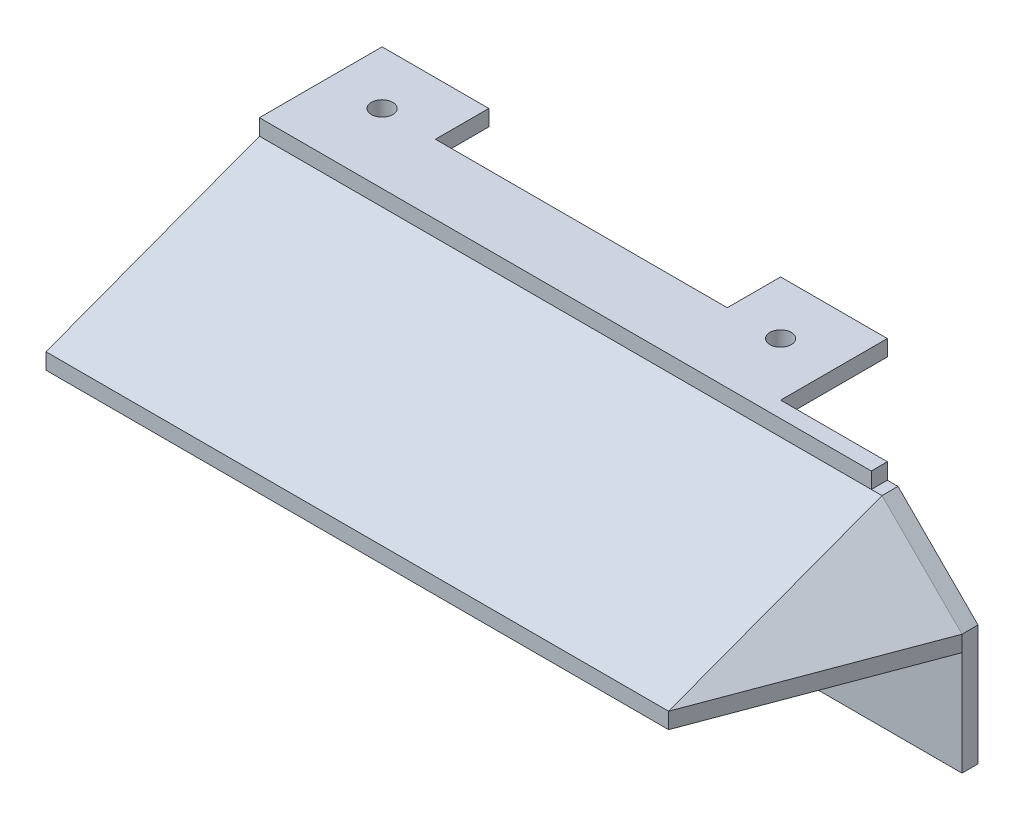
ISO-10303-21;
HEADER;
FILE_DESCRIPTION(('STEP AP214'),'2;1');
FILE_NAME('part.step','',(''),(''),'','','');
FILE_SCHEMA(('AUTOMOTIVE_DESIGN { 1 0 10303 214 1 1 1 1 }'));
ENDSEC;
DATA;
#1=APPLICATION_CONTEXT('core data for automotive mechanical design processes');
#2=APPLICATION_PROTOCOL_DEFINITION('international standard','automotive_design',2000,#1);
#3=PRODUCT_CONTEXT('',#1,'mechanical');
#4=PRODUCT('Part','Part','',(#3));
#5=PRODUCT_RELATED_PRODUCT_CATEGORY('part','',(#4));
#6=PRODUCT_DEFINITION_FORMATION('','',#4);
#7=PRODUCT_DEFINITION_CONTEXT('part definition',#1,'design');
#8=PRODUCT_DEFINITION('design','',#6,#7);
#9=PRODUCT_DEFINITION_SHAPE('','',#8);
#10=(LENGTH_UNIT() NAMED_UNIT(*) SI_UNIT(.MILLI.,.METRE.));
#11=(NAMED_UNIT(*) PLANE_ANGLE_UNIT() SI_UNIT($,.RADIAN.));
#12=(NAMED_UNIT(*) SI_UNIT($,.STERADIAN.) SOLID_ANGLE_UNIT());
#13=UNCERTAINTY_MEASURE_WITH_UNIT(LENGTH_MEASURE(1.E-05),#10,'distance_accuracy_value','');
#14=(GEOMETRIC_REPRESENTATION_CONTEXT(3) GLOBAL_UNCERTAINTY_ASSIGNED_CONTEXT((#13)) GLOBAL_UNIT_ASSIGNED_CONTEXT((#10,
#11,#12)) REPRESENTATION_CONTEXT('',''));
#15=CARTESIAN_POINT('',(0.,0.,0.));
#16=DIRECTION('',(0.,0.,1.));
#17=DIRECTION('',(1.,0.,0.));
#18=AXIS2_PLACEMENT_3D('',#15,#16,#17);
#19=CARTESIAN_POINT('',(0.,0.,-37.2162428883249));
#20=DIRECTION('',(0.,0.,1.));
#21=DIRECTION('',(1.,0.,0.));
#22=AXIS2_PLACEMENT_3D('',#19,#20,#21);
#23=PLANE('',#22);
#24=DIRECTION('',(1.,0.,0.));
#25=VECTOR('',#24,1.);
#26=CARTESIAN_POINT('',(0.,-14.9977348289667,-37.2162428883249));
#27=LINE('',#26,#25);
#28=CARTESIAN_POINT('',(-122.390736685816,-14.9977348289667,-37.2162428883249));
#29=VERTEX_POINT('',#28);
#30=CARTESIAN_POINT('',(4.91634592782475,-14.9977348289667,-37.2162428883249));
#31=VERTEX_POINT('',#30);
#32=EDGE_CURVE('E376',#29,#31,#27,.T.);
#33=ORIENTED_EDGE('',*,*,#32,.T.);
#34=DIRECTION('',(0.662200830713101,-0.749326404047582,0.));
#35=VECTOR('',#34,1.);
#36=CARTESIAN_POINT('',(-5.68638997938709,-3.00000000000002,-37.2162428883249));
#37=LINE('',#36,#35);
#38=CARTESIAN_POINT('',(-5.68638997938709,-3.00000000000001,-37.2162428883249));
#39=VERTEX_POINT('',#38);
#40=EDGE_CURVE('E203',#39,#31,#37,.T.);
#41=ORIENTED_EDGE('',*,*,#40,.F.);
#42=DIRECTION('',(1.,0.,0.));
#43=VECTOR('',#42,1.);
#44=CARTESIAN_POINT('',(-122.390736685816,-3.00000000000001,-37.2162428883249));
#45=LINE('',#44,#43);
#46=CARTESIAN_POINT('',(-122.390736685816,-3.00000000000001,-37.2162428883249));
#47=VERTEX_POINT('',#46);
#48=EDGE_CURVE('E394',#47,#39,#45,.T.);
#49=ORIENTED_EDGE('',*,*,#48,.F.);
#50=DIRECTION('',(0.,-1.,0.));
#51=VECTOR('',#50,1.);
#52=CARTESIAN_POINT('',(-122.390736685816,0.,-37.2162428883249));
#53=LINE('',#52,#51);
#54=EDGE_CURVE('E492',#47,#29,#53,.T.);
#55=ORIENTED_EDGE('',*,*,#54,.T.);
#56=EDGE_LOOP('',(#33,#41,#49,#55));
#57=FACE_BOUND('',#56,.T.);
#58=ADVANCED_FACE('F49',(#57),#23,.T.);
#59=DIRECTION('',(0.,-1.,0.));
#60=VECTOR('',#59,1.);
#61=CARTESIAN_POINT('',(9.31134484957959,0.,-37.2162428883249));
#62=LINE('',#61,#60);
#63=CARTESIAN_POINT('',(9.31134484957959,-17.9977348289667,-37.2162428883249));
#64=VERTEX_POINT('',#63);
#65=CARTESIAN_POINT('',(9.31134484957959,-37.5577348289667,-37.2162428883249));
#66=VERTEX_POINT('',#65);
#67=EDGE_CURVE('E253',#64,#66,#62,.T.);
#68=ORIENTED_EDGE('',*,*,#67,.F.);
#69=DIRECTION('',(-1.,0.,0.));
#70=VECTOR('',#69,1.);
#71=CARTESIAN_POINT('',(0.,-17.9977348289667,-37.2162428883249));
#72=LINE('',#71,#70);
#73=CARTESIAN_POINT('',(-122.390736685816,-17.9977348289667,-37.2162428883249));
#74=VERTEX_POINT('',#73);
#75=EDGE_CURVE('E228',#64,#74,#72,.T.);
#76=ORIENTED_EDGE('',*,*,#75,.T.);
#77=CARTESIAN_POINT('',(-122.390736685816,-37.5577348289667,-37.2162428883249));
#78=VERTEX_POINT('',#77);
#79=EDGE_CURVE('E489',#74,#78,#53,.T.);
#80=ORIENTED_EDGE('',*,*,#79,.T.);
#81=DIRECTION('',(-1.,0.,0.));
#82=VECTOR('',#81,1.);
#83=CARTESIAN_POINT('',(0.,-37.5577348289667,-37.2162428883249));
#84=LINE('',#83,#82);
#85=EDGE_CURVE('E259',#66,#78,#84,.T.);
#86=ORIENTED_EDGE('',*,*,#85,.F.);
#87=EDGE_LOOP('',(#68,#76,#80,#86));
#88=FACE_BOUND('',#87,.T.);
#89=ADVANCED_FACE('F339',(#88),#23,.T.);
#90=CARTESIAN_POINT('',(-122.390736685816,3.,-37.2162428883249));
#91=VERTEX_POINT('',#90);
#92=CARTESIAN_POINT('',(-122.390736685816,0.,-37.2162428883249));
#93=VERTEX_POINT('',#92);
#94=EDGE_CURVE('E67',#91,#93,#53,.T.);
#95=ORIENTED_EDGE('',*,*,#94,.T.);
#96=DIRECTION('',(-1.,0.,0.));
#97=VECTOR('',#96,1.);
#98=CARTESIAN_POINT('',(-7.68638997938709,0.,-37.2162428883249));
#99=LINE('',#98,#97);
#100=CARTESIAN_POINT('',(-7.68638997938709,0.,-37.2162428883249));
#101=VERTEX_POINT('',#100);
#102=EDGE_CURVE('E466',#101,#93,#99,.T.);
#103=ORIENTED_EDGE('',*,*,#102,.F.);
#104=DIRECTION('',(0.,-1.,0.));
#105=VECTOR('',#104,1.);
#106=CARTESIAN_POINT('',(-7.68638997938709,0.,-37.2162428883249));
#107=LINE('',#106,#105);
#108=CARTESIAN_POINT('',(-7.68638997938709,3.,-37.2162428883249));
#109=VERTEX_POINT('',#108);
#110=EDGE_CURVE('E448',#109,#101,#107,.T.);
#111=ORIENTED_EDGE('',*,*,#110,.F.);
#112=DIRECTION('',(-1.,0.,0.));
#113=VECTOR('',#112,1.);
#114=CARTESIAN_POINT('',(0.,3.,-37.2162428883249));
#115=LINE('',#114,#113);
#116=EDGE_CURVE('E453',#109,#91,#115,.T.);
#117=ORIENTED_EDGE('',*,*,#116,.T.);
#118=EDGE_LOOP('',(#95,#103,#111,#117));
#119=FACE_BOUND('',#118,.T.);
#120=ADVANCED_FACE('F342',(#119),#23,.T.);
#121=CARTESIAN_POINT('',(0.,-14.9977348289667,2.78375711167515));
#122=DIRECTION('',(0.,1.,0.));
#123=DIRECTION('',(0.,0.,1.));
#124=AXIS2_PLACEMENT_3D('',#121,#122,#123);
#125=PLANE('',#124);
#126=DIRECTION('',(0.,0.,-1.));
#127=VECTOR('',#126,1.);
#128=CARTESIAN_POINT('',(-122.390736685816,-14.9977348289667,2.78375711167515));
#129=LINE('',#128,#127);
#130=CARTESIAN_POINT('',(-122.390736685816,-14.9977348289667,-2.21624288832485));
#131=VERTEX_POINT('',#130);
#132=EDGE_CURVE('E479',#131,#29,#129,.T.);
#133=ORIENTED_EDGE('',*,*,#132,.F.);
#134=DIRECTION('',(-1.,0.,0.));
#135=VECTOR('',#134,1.);
#136=CARTESIAN_POINT('',(-7.68638997938709,-14.9977348289667,-2.21624288832487));
#137=LINE('',#136,#135);
#138=CARTESIAN_POINT('',(-7.68638997938709,-14.9977348289667,-2.21624288832487));
#139=VERTEX_POINT('',#138);
#140=EDGE_CURVE('E241',#139,#131,#137,.T.);
#141=ORIENTED_EDGE('',*,*,#140,.F.);
#142=DIRECTION('',(-1.,0.,0.));
#143=VECTOR('',#142,1.);
#144=CARTESIAN_POINT('',(-5.68638997938709,-14.9977348289667,-2.21624288832487));
#145=LINE('',#144,#143);
#146=CARTESIAN_POINT('',(-5.68638997938709,-14.9977348289667,-2.21624288832485));
#147=VERTEX_POINT('',#146);
#148=EDGE_CURVE('E217',#147,#139,#145,.T.);
#149=ORIENTED_EDGE('',*,*,#148,.F.);
#150=DIRECTION('',(-0.28992412875032,0.,0.957049632761211));
#151=VECTOR('',#150,1.);
#152=CARTESIAN_POINT('',(-0.385022025781169,-14.9977348289667,-19.7162428883249));
#153=LINE('',#152,#151);
#154=EDGE_CURVE('E204',#31,#147,#153,.T.);
#155=ORIENTED_EDGE('',*,*,#154,.F.);
#156=ORIENTED_EDGE('',*,*,#32,.F.);
#157=EDGE_LOOP('',(#133,#141,#149,#155,#156));
#158=FACE_BOUND('',#157,.T.);
#159=ADVANCED_FACE('F335',(#158),#125,.T.);
#160=CARTESIAN_POINT('',(0.,3.,-50.2162428883248));
#161=DIRECTION('',(0.,0.,1.));
#162=DIRECTION('',(1.,0.,0.));
#163=AXIS2_PLACEMENT_3D('',#160,#161,#162);
#164=PLANE('',#163);
#165=DIRECTION('',(0.,-1.,0.));
#166=VECTOR('',#165,1.);
#167=CARTESIAN_POINT('',(-102.390736685816,0.,-50.2162428883248));
#168=LINE('',#167,#166);
#169=CARTESIAN_POINT('',(-102.390736685816,3.,-50.2162428883248));
#170=VERTEX_POINT('',#169);
#171=CARTESIAN_POINT('',(-102.390736685816,0.,-50.2162428883248));
#172=VERTEX_POINT('',#171);
#173=EDGE_CURVE('E825',#170,#172,#168,.T.);
#174=ORIENTED_EDGE('',*,*,#173,.F.);
#175=DIRECTION('',(-1.,0.,0.));
#176=VECTOR('',#175,1.);
#177=CARTESIAN_POINT('',(0.,3.,-50.2162428883248));
#178=LINE('',#177,#176);
#179=CARTESIAN_POINT('',(-47.6863899793871,3.,-50.2162428883248));
#180=VERTEX_POINT('',#179);
#181=EDGE_CURVE('E865',#180,#170,#178,.T.);
#182=ORIENTED_EDGE('',*,*,#181,.F.);
#183=DIRECTION('',(0.,1.,0.));
#184=VECTOR('',#183,1.);
#185=CARTESIAN_POINT('',(-47.6863899793871,0.,-50.2162428883248));
#186=LINE('',#185,#184);
#187=CARTESIAN_POINT('',(-47.6863899793871,0.,-50.2162428883248));
#188=VERTEX_POINT('',#187);
#189=EDGE_CURVE('E848',#188,#180,#186,.T.);
#190=ORIENTED_EDGE('',*,*,#189,.F.);
#191=DIRECTION('',(-1.,0.,0.));
#192=VECTOR('',#191,1.);
#193=CARTESIAN_POINT('',(0.,0.,-50.2162428883248));
#194=LINE('',#193,#192);
#195=EDGE_CURVE('E864',#188,#172,#194,.T.);
#196=ORIENTED_EDGE('',*,*,#195,.T.);
#197=EDGE_LOOP('',(#174,#182,#190,#196));
#198=FACE_BOUND('',#197,.T.);
#199=ADVANCED_FACE('F51',(#198),#164,.F.);
#200=CARTESIAN_POINT('',(-122.390736685816,3.,0.));
#201=DIRECTION('',(1.,0.,0.));
#202=DIRECTION('',(0.,0.,-1.));
#203=AXIS2_PLACEMENT_3D('',#200,#201,#202);
#204=PLANE('',#203);
#205=DIRECTION('',(0.,-0.324269541445589,0.945964726874458));
#206=VECTOR('',#205,1.);
#207=CARTESIAN_POINT('',(-122.390736685816,-3.00000000000001,-37.2162428883249));
#208=LINE('',#207,#206);
#209=EDGE_CURVE('E387',#47,#131,#208,.T.);
#210=ORIENTED_EDGE('',*,*,#209,.T.);
#211=ORIENTED_EDGE('',*,*,#132,.T.);
#212=ORIENTED_EDGE('',*,*,#54,.F.);
#213=EDGE_LOOP('',(#210,#211,#212));
#214=FACE_BOUND('',#213,.T.);
#215=DIRECTION('',(0.,0.,1.));
#216=VECTOR('',#215,1.);
#217=CARTESIAN_POINT('',(-122.390736685816,0.,0.));
#218=LINE('',#217,#216);
#219=CARTESIAN_POINT('',(-122.390736685816,0.,-60.2162428883249));
#220=VERTEX_POINT('',#219);
#221=CARTESIAN_POINT('',(-122.390736685816,0.,-40.2162428883249));
#222=VERTEX_POINT('',#221);
#223=EDGE_CURVE('E874',#220,#222,#218,.T.);
#224=ORIENTED_EDGE('',*,*,#223,.T.);
#225=DIRECTION('',(0.,-1.,0.));
#226=VECTOR('',#225,1.);
#227=CARTESIAN_POINT('',(-122.390736685816,0.,-40.2162428883249));
#228=LINE('',#227,#226);
#229=CARTESIAN_POINT('',(-122.390736685816,-37.5577348289667,-40.2162428883249));
#230=VERTEX_POINT('',#229);
#231=EDGE_CURVE('E483',#222,#230,#228,.T.);
#232=ORIENTED_EDGE('',*,*,#231,.T.);
#233=DIRECTION('',(0.,0.,-1.));
#234=VECTOR('',#233,1.);
#235=CARTESIAN_POINT('',(-122.390736685816,-37.5577348289667,-37.2162428883249));
#236=LINE('',#235,#234);
#237=EDGE_CURVE('E815',#78,#230,#236,.T.);
#238=ORIENTED_EDGE('',*,*,#237,.F.);
#239=ORIENTED_EDGE('',*,*,#79,.F.);
#240=DIRECTION('',(0.,0.,-1.));
#241=VECTOR('',#240,1.);
#242=CARTESIAN_POINT('',(-122.390736685816,-17.9977348289667,2.78375711167515));
#243=LINE('',#242,#241);
#244=CARTESIAN_POINT('',(-122.390736685816,-17.9977348289667,2.78375711167515));
#245=VERTEX_POINT('',#244);
#246=EDGE_CURVE('E434',#245,#74,#243,.T.);
#247=ORIENTED_EDGE('',*,*,#246,.F.);
#248=DIRECTION('',(0.,-1.,0.));
#249=VECTOR('',#248,1.);
#250=CARTESIAN_POINT('',(-122.390736685816,0.,2.78375711167515));
#251=LINE('',#250,#249);
#252=CARTESIAN_POINT('',(-122.390736685816,-14.9977348289667,2.78375711167515));
#253=VERTEX_POINT('',#252);
#254=EDGE_CURVE('E227',#253,#245,#251,.T.);
#255=ORIENTED_EDGE('',*,*,#254,.F.);
#256=DIRECTION('',(0.,-0.351076953808431,0.936346609170233));
#257=VECTOR('',#256,1.);
#258=CARTESIAN_POINT('',(-122.390736685816,0.,-37.2162428883249));
#259=LINE('',#258,#257);
#260=EDGE_CURVE('E224',#93,#253,#259,.T.);
#261=ORIENTED_EDGE('',*,*,#260,.F.);
#262=ORIENTED_EDGE('',*,*,#94,.F.);
#263=DIRECTION('',(0.,0.,1.));
#264=VECTOR('',#263,1.);
#265=CARTESIAN_POINT('',(-122.390736685816,3.,0.));
#266=LINE('',#265,#264);
#267=CARTESIAN_POINT('',(-122.390736685816,3.,-60.2162428883249));
#268=VERTEX_POINT('',#267);
#269=EDGE_CURVE('E868',#268,#91,#266,.T.);
#270=ORIENTED_EDGE('',*,*,#269,.F.);
#271=DIRECTION('',(0.,1.,0.));
#272=VECTOR('',#271,1.);
#273=CARTESIAN_POINT('',(-122.390736685816,3.,-60.2162428883249));
#274=LINE('',#273,#272);
#275=EDGE_CURVE('E821',#220,#268,#274,.T.);
#276=ORIENTED_EDGE('',*,*,#275,.F.);
#277=EDGE_LOOP('',(#224,#232,#238,#239,#247,#255,#261,#262,#270,#276));
#278=FACE_BOUND('',#277,.T.);
#279=ADVANCED_FACE('F327',(#214,#278),#204,.F.);
#280=CARTESIAN_POINT('',(-27.6863899793871,3.,0.));
#281=DIRECTION('',(1.,0.,0.));
#282=DIRECTION('',(0.,0.,-1.));
#283=AXIS2_PLACEMENT_3D('',#280,#281,#282);
#284=PLANE('',#283);
#285=DIRECTION('',(0.,0.,1.));
#286=VECTOR('',#285,1.);
#287=CARTESIAN_POINT('',(-27.6863899793871,0.,0.));
#288=LINE('',#287,#286);
#289=CARTESIAN_POINT('',(-27.6863899793871,0.,-60.2162428883249));
#290=VERTEX_POINT('',#289);
#291=CARTESIAN_POINT('',(-27.6863899793871,0.,-40.2162428883248));
#292=VERTEX_POINT('',#291);
#293=EDGE_CURVE('E869',#290,#292,#288,.T.);
#294=ORIENTED_EDGE('',*,*,#293,.F.);
#295=DIRECTION('',(0.,-1.,0.));
#296=VECTOR('',#295,1.);
#297=CARTESIAN_POINT('',(-27.6863899793871,0.,-60.2162428883249));
#298=LINE('',#297,#296);
#299=CARTESIAN_POINT('',(-27.6863899793871,3.,-60.2162428883249));
#300=VERTEX_POINT('',#299);
#301=EDGE_CURVE('E853',#300,#290,#298,.T.);
#302=ORIENTED_EDGE('',*,*,#301,.F.);
#303=DIRECTION('',(0.,0.,1.));
#304=VECTOR('',#303,1.);
#305=CARTESIAN_POINT('',(-27.6863899793871,3.,0.));
#306=LINE('',#305,#304);
#307=CARTESIAN_POINT('',(-27.6863899793871,3.,-40.2162428883249));
#308=VERTEX_POINT('',#307);
#309=EDGE_CURVE('E59',#300,#308,#306,.T.);
#310=ORIENTED_EDGE('',*,*,#309,.T.);
#311=DIRECTION('',(0.,-1.,0.));
#312=VECTOR('',#311,1.);
#313=CARTESIAN_POINT('',(-27.6863899793871,3.,-40.2162428883248));
#314=LINE('',#313,#312);
#315=EDGE_CURVE('E12',#308,#292,#314,.T.);
#316=ORIENTED_EDGE('',*,*,#315,.T.);
#317=EDGE_LOOP('',(#294,#302,#310,#316));
#318=FACE_BOUND('',#317,.T.);
#319=ADVANCED_FACE('F321',(#318),#284,.T.);
#320=CARTESIAN_POINT('',(0.,3.,0.));
#321=DIRECTION('',(0.,1.,0.));
#322=DIRECTION('',(0.,0.,1.));
#323=AXIS2_PLACEMENT_3D('',#320,#321,#322);
#324=PLANE('',#323);
#325=CARTESIAN_POINT('',(-112.390736685816,3.,-50.2162428883248));
#326=DIRECTION('',(0.,1.,0.));
#327=DIRECTION('',(0.,0.,1.));
#328=AXIS2_PLACEMENT_3D('',#325,#326,#327);
#329=CIRCLE('',#328,2.);
#330=CARTESIAN_POINT('',(-112.390736685816,3.,-48.2162428883249));
#331=VERTEX_POINT('',#330);
#332=EDGE_CURVE('E818',#331,#331,#329,.T.);
#333=ORIENTED_EDGE('',*,*,#332,.F.);
#334=EDGE_LOOP('',(#333));
#335=FACE_BOUND('',#334,.T.);
#336=CARTESIAN_POINT('',(-37.6863899793871,3.,-50.2162428883248));
#337=DIRECTION('',(0.,1.,0.));
#338=DIRECTION('',(0.,0.,1.));
#339=AXIS2_PLACEMENT_3D('',#336,#337,#338);
#340=CIRCLE('',#339,2.);
#341=CARTESIAN_POINT('',(-37.6863899793871,3.,-48.2162428883248));
#342=VERTEX_POINT('',#341);
#343=EDGE_CURVE('E840',#342,#342,#340,.T.);
#344=ORIENTED_EDGE('',*,*,#343,.F.);
#345=EDGE_LOOP('',(#344));
#346=FACE_BOUND('',#345,.T.);
#347=ORIENTED_EDGE('',*,*,#309,.F.);
#348=DIRECTION('',(1.,0.,0.));
#349=VECTOR('',#348,1.);
#350=CARTESIAN_POINT('',(-27.6863899793871,3.,-60.2162428883249));
#351=LINE('',#350,#349);
#352=CARTESIAN_POINT('',(-47.6863899793871,3.,-60.2162428883249));
#353=VERTEX_POINT('',#352);
#354=EDGE_CURVE('E850',#353,#300,#351,.T.);
#355=ORIENTED_EDGE('',*,*,#354,.F.);
#356=DIRECTION('',(0.,0.,1.));
#357=VECTOR('',#356,1.);
#358=CARTESIAN_POINT('',(-47.6863899793871,3.,-60.2162428883249));
#359=LINE('',#358,#357);
#360=EDGE_CURVE('E856',#353,#180,#359,.T.);
#361=ORIENTED_EDGE('',*,*,#360,.T.);
#362=ORIENTED_EDGE('',*,*,#181,.T.);
#363=DIRECTION('',(0.,0.,1.));
#364=VECTOR('',#363,1.);
#365=CARTESIAN_POINT('',(-102.390736685816,3.,-60.2162428883249));
#366=LINE('',#365,#364);
#367=CARTESIAN_POINT('',(-102.390736685816,3.,-60.2162428883249));
#368=VERTEX_POINT('',#367);
#369=EDGE_CURVE('E837',#368,#170,#366,.T.);
#370=ORIENTED_EDGE('',*,*,#369,.F.);
#371=DIRECTION('',(1.,0.,0.));
#372=VECTOR('',#371,1.);
#373=CARTESIAN_POINT('',(-102.390736685816,3.,-60.2162428883249));
#374=LINE('',#373,#372);
#375=EDGE_CURVE('E824',#268,#368,#374,.T.);
#376=ORIENTED_EDGE('',*,*,#375,.F.);
#377=ORIENTED_EDGE('',*,*,#269,.T.);
#378=ORIENTED_EDGE('',*,*,#116,.F.);
#379=DIRECTION('',(0.,0.,-1.));
#380=VECTOR('',#379,1.);
#381=CARTESIAN_POINT('',(-7.68638997938709,3.,-37.2162428883249));
#382=LINE('',#381,#380);
#383=CARTESIAN_POINT('',(-7.68638997938709,3.,-40.2162428883249));
#384=VERTEX_POINT('',#383);
#385=EDGE_CURVE('E812',#109,#384,#382,.T.);
#386=ORIENTED_EDGE('',*,*,#385,.T.);
#387=DIRECTION('',(-1.,0.,0.));
#388=VECTOR('',#387,1.);
#389=CARTESIAN_POINT('',(0.,3.,-40.2162428883249));
#390=LINE('',#389,#388);
#391=EDGE_CURVE('E493',#384,#308,#390,.T.);
#392=ORIENTED_EDGE('',*,*,#391,.T.);
#393=EDGE_LOOP('',(#347,#355,#361,#362,#370,#376,#377,#378,#386,#392));
#394=FACE_BOUND('',#393,.T.);
#395=ADVANCED_FACE('F318',(#335,#346,#394),#324,.T.);
#396=CARTESIAN_POINT('',(0.,0.,0.));
#397=DIRECTION('',(0.,1.,0.));
#398=DIRECTION('',(0.,0.,1.));
#399=AXIS2_PLACEMENT_3D('',#396,#397,#398);
#400=PLANE('',#399);
#401=CARTESIAN_POINT('',(-112.390736685816,0.,-50.2162428883248));
#402=DIRECTION('',(0.,1.,0.));
#403=DIRECTION('',(0.,0.,1.));
#404=AXIS2_PLACEMENT_3D('',#401,#402,#403);
#405=CIRCLE('',#404,2.);
#406=CARTESIAN_POINT('',(-112.390736685816,0.,-48.2162428883249));
#407=VERTEX_POINT('',#406);
#408=EDGE_CURVE('E484',#407,#407,#405,.T.);
#409=ORIENTED_EDGE('',*,*,#408,.T.);
#410=EDGE_LOOP('',(#409));
#411=FACE_BOUND('',#410,.T.);
#412=CARTESIAN_POINT('',(-37.6863899793871,0.,-50.2162428883248));
#413=DIRECTION('',(0.,1.,0.));
#414=DIRECTION('',(0.,0.,1.));
#415=AXIS2_PLACEMENT_3D('',#412,#413,#414);
#416=CIRCLE('',#415,2.);
#417=CARTESIAN_POINT('',(-37.6863899793871,0.,-48.2162428883248));
#418=VERTEX_POINT('',#417);
#419=EDGE_CURVE('E843',#418,#418,#416,.T.);
#420=ORIENTED_EDGE('',*,*,#419,.T.);
#421=EDGE_LOOP('',(#420));
#422=FACE_BOUND('',#421,.T.);
#423=ORIENTED_EDGE('',*,*,#195,.F.);
#424=DIRECTION('',(0.,0.,1.));
#425=VECTOR('',#424,1.);
#426=CARTESIAN_POINT('',(-47.6863899793871,0.,-60.2162428883249));
#427=LINE('',#426,#425);
#428=CARTESIAN_POINT('',(-47.6863899793871,0.,-60.2162428883249));
#429=VERTEX_POINT('',#428);
#430=EDGE_CURVE('E861',#429,#188,#427,.T.);
#431=ORIENTED_EDGE('',*,*,#430,.F.);
#432=DIRECTION('',(-1.,0.,0.));
#433=VECTOR('',#432,1.);
#434=CARTESIAN_POINT('',(-27.6863899793871,0.,-60.2162428883249));
#435=LINE('',#434,#433);
#436=EDGE_CURVE('E844',#290,#429,#435,.T.);
#437=ORIENTED_EDGE('',*,*,#436,.F.);
#438=ORIENTED_EDGE('',*,*,#293,.T.);
#439=DIRECTION('',(-1.,0.,0.));
#440=VECTOR('',#439,1.);
#441=CARTESIAN_POINT('',(0.,0.,-40.2162428883249));
#442=LINE('',#441,#440);
#443=EDGE_CURVE('E877',#292,#222,#442,.T.);
#444=ORIENTED_EDGE('',*,*,#443,.T.);
#445=ORIENTED_EDGE('',*,*,#223,.F.);
#446=DIRECTION('',(-1.,0.,0.));
#447=VECTOR('',#446,1.);
#448=CARTESIAN_POINT('',(-122.390736685816,0.,-60.2162428883249));
#449=LINE('',#448,#447);
#450=CARTESIAN_POINT('',(-102.390736685816,0.,-60.2162428883249));
#451=VERTEX_POINT('',#450);
#452=EDGE_CURVE('E829',#451,#220,#449,.T.);
#453=ORIENTED_EDGE('',*,*,#452,.F.);
#454=DIRECTION('',(0.,0.,1.));
#455=VECTOR('',#454,1.);
#456=CARTESIAN_POINT('',(-102.390736685816,0.,-60.2162428883249));
#457=LINE('',#456,#455);
#458=EDGE_CURVE('E832',#451,#172,#457,.T.);
#459=ORIENTED_EDGE('',*,*,#458,.T.);
#460=EDGE_LOOP('',(#423,#431,#437,#438,#444,#445,#453,#459));
#461=FACE_BOUND('',#460,.T.);
#462=ADVANCED_FACE('F316',(#411,#422,#461),#400,.F.);
#463=CARTESIAN_POINT('',(-47.6863899793871,0.,-60.2162428883249));
#464=DIRECTION('',(1.,0.,0.));
#465=DIRECTION('',(0.,0.,-1.));
#466=AXIS2_PLACEMENT_3D('',#463,#464,#465);
#467=PLANE('',#466);
#468=ORIENTED_EDGE('',*,*,#189,.T.);
#469=ORIENTED_EDGE('',*,*,#360,.F.);
#470=DIRECTION('',(0.,1.,0.));
#471=VECTOR('',#470,1.);
#472=CARTESIAN_POINT('',(-47.6863899793871,0.,-60.2162428883249));
#473=LINE('',#472,#471);
#474=EDGE_CURVE('E847',#429,#353,#473,.T.);
#475=ORIENTED_EDGE('',*,*,#474,.F.);
#476=ORIENTED_EDGE('',*,*,#430,.T.);
#477=EDGE_LOOP('',(#468,#469,#475,#476));
#478=FACE_BOUND('',#477,.T.);
#479=ADVANCED_FACE('F312',(#478),#467,.F.);
#480=CARTESIAN_POINT('',(0.,0.,-60.2162428883249));
#481=DIRECTION('',(0.,0.,-1.));
#482=DIRECTION('',(-1.,0.,0.));
#483=AXIS2_PLACEMENT_3D('',#480,#481,#482);
#484=PLANE('',#483);
#485=ORIENTED_EDGE('',*,*,#436,.T.);
#486=ORIENTED_EDGE('',*,*,#474,.T.);
#487=ORIENTED_EDGE('',*,*,#354,.T.);
#488=ORIENTED_EDGE('',*,*,#301,.T.);
#489=EDGE_LOOP('',(#485,#486,#487,#488));
#490=FACE_BOUND('',#489,.T.);
#491=ADVANCED_FACE('F308',(#490),#484,.T.);
#492=CARTESIAN_POINT('',(-37.6863899793871,-7.,-50.2162428883248));
#493=DIRECTION('',(0.,1.,0.));
#494=DIRECTION('',(0.,0.,1.));
#495=AXIS2_PLACEMENT_3D('',#492,#493,#494);
#496=CYLINDRICAL_SURFACE('',#495,2.);
#497=ORIENTED_EDGE('',*,*,#343,.T.);
#498=EDGE_LOOP('',(#497));
#499=FACE_BOUND('',#498,.T.);
#500=ORIENTED_EDGE('',*,*,#419,.F.);
#501=EDGE_LOOP('',(#500));
#502=FACE_BOUND('',#501,.T.);
#503=ADVANCED_FACE('F304',(#499,#502),#496,.F.);
#504=CARTESIAN_POINT('',(-102.390736685816,0.,-60.2162428883249));
#505=DIRECTION('',(-1.,0.,0.));
#506=DIRECTION('',(0.,0.,1.));
#507=AXIS2_PLACEMENT_3D('',#504,#505,#506);
#508=PLANE('',#507);
#509=ORIENTED_EDGE('',*,*,#173,.T.);
#510=ORIENTED_EDGE('',*,*,#458,.F.);
#511=DIRECTION('',(0.,-1.,0.));
#512=VECTOR('',#511,1.);
#513=CARTESIAN_POINT('',(-102.390736685816,0.,-60.2162428883249));
#514=LINE('',#513,#512);
#515=EDGE_CURVE('E827',#368,#451,#514,.T.);
#516=ORIENTED_EDGE('',*,*,#515,.F.);
#517=ORIENTED_EDGE('',*,*,#369,.T.);
#518=EDGE_LOOP('',(#509,#510,#516,#517));
#519=FACE_BOUND('',#518,.T.);
#520=ADVANCED_FACE('F300',(#519),#508,.F.);
#521=CARTESIAN_POINT('',(0.,0.,-60.2162428883249));
#522=DIRECTION('',(0.,0.,1.));
#523=DIRECTION('',(1.,0.,0.));
#524=AXIS2_PLACEMENT_3D('',#521,#522,#523);
#525=PLANE('',#524);
#526=ORIENTED_EDGE('',*,*,#275,.T.);
#527=ORIENTED_EDGE('',*,*,#375,.T.);
#528=ORIENTED_EDGE('',*,*,#515,.T.);
#529=ORIENTED_EDGE('',*,*,#452,.T.);
#530=EDGE_LOOP('',(#526,#527,#528,#529));
#531=FACE_BOUND('',#530,.T.);
#532=ADVANCED_FACE('F296',(#531),#525,.F.);
#533=CARTESIAN_POINT('',(-112.390736685816,-17.,-50.2162428883248));
#534=DIRECTION('',(0.,1.,0.));
#535=DIRECTION('',(0.,0.,1.));
#536=AXIS2_PLACEMENT_3D('',#533,#534,#535);
#537=CYLINDRICAL_SURFACE('',#536,2.);
#538=ORIENTED_EDGE('',*,*,#332,.T.);
#539=EDGE_LOOP('',(#538));
#540=FACE_BOUND('',#539,.T.);
#541=ORIENTED_EDGE('',*,*,#408,.F.);
#542=EDGE_LOOP('',(#541));
#543=FACE_BOUND('',#542,.T.);
#544=ADVANCED_FACE('F292',(#540,#543),#537,.F.);
#545=CARTESIAN_POINT('',(0.,-37.5577348289667,-37.2162428883249));
#546=DIRECTION('',(0.,-1.,0.));
#547=DIRECTION('',(0.,0.,-1.));
#548=AXIS2_PLACEMENT_3D('',#545,#546,#547);
#549=PLANE('',#548);
#550=DIRECTION('',(-1.,0.,0.));
#551=VECTOR('',#550,1.);
#552=CARTESIAN_POINT('',(0.,-37.5577348289667,-40.2162428883249));
#553=LINE('',#552,#551);
#554=CARTESIAN_POINT('',(9.31134484957959,-37.5577348289667,-40.2162428883249));
#555=VERTEX_POINT('',#554);
#556=EDGE_CURVE('E900',#555,#230,#553,.T.);
#557=ORIENTED_EDGE('',*,*,#556,.F.);
#558=DIRECTION('',(0.,0.,-1.));
#559=VECTOR('',#558,1.);
#560=CARTESIAN_POINT('',(9.31134484957959,-37.5577348289667,-37.2162428883249));
#561=LINE('',#560,#559);
#562=EDGE_CURVE('E248',#66,#555,#561,.T.);
#563=ORIENTED_EDGE('',*,*,#562,.F.);
#564=ORIENTED_EDGE('',*,*,#85,.T.);
#565=ORIENTED_EDGE('',*,*,#237,.T.);
#566=EDGE_LOOP('',(#557,#563,#564,#565));
#567=FACE_BOUND('',#566,.T.);
#568=ADVANCED_FACE('F288',(#567),#549,.T.);
#569=CARTESIAN_POINT('',(9.31134484957959,0.,-37.2162428883249));
#570=DIRECTION('',(1.,0.,0.));
#571=DIRECTION('',(0.,1.,0.));
#572=AXIS2_PLACEMENT_3D('',#569,#570,#571);
#573=PLANE('',#572);
#574=DIRECTION('',(0.,-1.,0.));
#575=VECTOR('',#574,1.);
#576=CARTESIAN_POINT('',(9.31134484957959,0.,-40.2162428883249));
#577=LINE('',#576,#575);
#578=CARTESIAN_POINT('',(9.31134484957959,-14.9977348289667,-40.2162428883249));
#579=VERTEX_POINT('',#578);
#580=EDGE_CURVE('E443',#579,#555,#577,.T.);
#581=ORIENTED_EDGE('',*,*,#580,.F.);
#582=DIRECTION('',(0.,0.,-1.));
#583=VECTOR('',#582,1.);
#584=CARTESIAN_POINT('',(9.31134484957959,-14.9977348289667,-37.2162428883249));
#585=LINE('',#584,#583);
#586=CARTESIAN_POINT('',(9.31134484957959,-14.9977348289667,-37.2162428883249));
#587=VERTEX_POINT('',#586);
#588=EDGE_CURVE('E246',#587,#579,#585,.T.);
#589=ORIENTED_EDGE('',*,*,#588,.F.);
#590=EDGE_CURVE('E199',#587,#64,#62,.T.);
#591=ORIENTED_EDGE('',*,*,#590,.T.);
#592=ORIENTED_EDGE('',*,*,#67,.T.);
#593=ORIENTED_EDGE('',*,*,#562,.T.);
#594=EDGE_LOOP('',(#581,#589,#591,#592,#593));
#595=FACE_BOUND('',#594,.T.);
#596=ADVANCED_FACE('F283',(#595),#573,.T.);
#597=CARTESIAN_POINT('',(-2.84319498969354,-2.84319498969354,-37.2162428883249));
#598=DIRECTION('',(0.707106781186547,0.707106781186547,0.));
#599=DIRECTION('',(-0.707106781186548,0.707106781186548,0.));
#600=AXIS2_PLACEMENT_3D('',#597,#598,#599);
#601=PLANE('',#600);
#602=DIRECTION('',(0.707106781186548,-0.707106781186548,0.));
#603=VECTOR('',#602,1.);
#604=CARTESIAN_POINT('',(-2.84319498969354,-2.84319498969354,-40.2162428883249));
#605=LINE('',#604,#603);
#606=CARTESIAN_POINT('',(-5.68638997938709,0.,-40.2162428883249));
#607=VERTEX_POINT('',#606);
#608=EDGE_CURVE('E803',#607,#579,#605,.T.);
#609=ORIENTED_EDGE('',*,*,#608,.F.);
#610=DIRECTION('',(0.,0.,-1.));
#611=VECTOR('',#610,1.);
#612=CARTESIAN_POINT('',(-5.68638997938709,0.,-37.2162428883249));
#613=LINE('',#612,#611);
#614=CARTESIAN_POINT('',(-5.68638997938709,0.,-37.2162428883249));
#615=VERTEX_POINT('',#614);
#616=EDGE_CURVE('E249',#615,#607,#613,.T.);
#617=ORIENTED_EDGE('',*,*,#616,.F.);
#618=CARTESIAN_POINT('',(-5.68638997938708,0.,-37.2162428883249));
#619=DIRECTION('',(0.707106781186547,-0.707106781186548,0.));
#620=VECTOR('',#619,1.);
#621=LINE('',#618,#620);
#622=EDGE_CURVE('E213',#615,#587,#621,.T.);
#623=ORIENTED_EDGE('',*,*,#622,.T.);
#624=ORIENTED_EDGE('',*,*,#588,.T.);
#625=EDGE_LOOP('',(#609,#617,#623,#624));
#626=FACE_BOUND('',#625,.T.);
#627=ADVANCED_FACE('F272',(#626),#601,.T.);
#628=CARTESIAN_POINT('',(0.,0.,-37.2162428883249));
#629=DIRECTION('',(0.,1.,0.));
#630=DIRECTION('',(0.,0.,1.));
#631=AXIS2_PLACEMENT_3D('',#628,#629,#630);
#632=PLANE('',#631);
#633=DIRECTION('',(1.,0.,0.));
#634=VECTOR('',#633,1.);
#635=CARTESIAN_POINT('',(0.,0.,-40.2162428883249));
#636=LINE('',#635,#634);
#637=CARTESIAN_POINT('',(-7.68638997938709,0.,-40.2162428883249));
#638=VERTEX_POINT('',#637);
#639=EDGE_CURVE('E800',#638,#607,#636,.T.);
#640=ORIENTED_EDGE('',*,*,#639,.F.);
#641=DIRECTION('',(0.,0.,-1.));
#642=VECTOR('',#641,1.);
#643=CARTESIAN_POINT('',(-7.68638997938709,0.,-37.2162428883249));
#644=LINE('',#643,#642);
#645=EDGE_CURVE('E268',#101,#638,#644,.T.);
#646=ORIENTED_EDGE('',*,*,#645,.F.);
#647=DIRECTION('',(1.,0.,0.));
#648=VECTOR('',#647,1.);
#649=CARTESIAN_POINT('',(0.,0.,-37.2162428883249));
#650=LINE('',#649,#648);
#651=EDGE_CURVE('E447',#101,#615,#650,.T.);
#652=ORIENTED_EDGE('',*,*,#651,.T.);
#653=ORIENTED_EDGE('',*,*,#616,.T.);
#654=EDGE_LOOP('',(#640,#646,#652,#653));
#655=FACE_BOUND('',#654,.T.);
#656=ADVANCED_FACE('F282',(#655),#632,.T.);
#657=CARTESIAN_POINT('',(-7.68638997938709,0.,-37.2162428883249));
#658=DIRECTION('',(1.,0.,0.));
#659=DIRECTION('',(0.,0.,-1.));
#660=AXIS2_PLACEMENT_3D('',#657,#658,#659);
#661=PLANE('',#660);
#662=DIRECTION('',(0.,-1.,0.));
#663=VECTOR('',#662,1.);
#664=CARTESIAN_POINT('',(-7.68638997938709,0.,-40.2162428883249));
#665=LINE('',#664,#663);
#666=EDGE_CURVE('E802',#384,#638,#665,.T.);
#667=ORIENTED_EDGE('',*,*,#666,.F.);
#668=ORIENTED_EDGE('',*,*,#385,.F.);
#669=ORIENTED_EDGE('',*,*,#110,.T.);
#670=ORIENTED_EDGE('',*,*,#645,.T.);
#671=EDGE_LOOP('',(#667,#668,#669,#670));
#672=FACE_BOUND('',#671,.T.);
#673=ADVANCED_FACE('F430',(#672),#661,.T.);
#674=CARTESIAN_POINT('',(0.,0.,-40.2162428883249));
#675=DIRECTION('',(0.,0.,1.));
#676=DIRECTION('',(1.,0.,0.));
#677=AXIS2_PLACEMENT_3D('',#674,#675,#676);
#678=PLANE('',#677);
#679=ORIENTED_EDGE('',*,*,#443,.F.);
#680=ORIENTED_EDGE('',*,*,#315,.F.);
#681=ORIENTED_EDGE('',*,*,#391,.F.);
#682=ORIENTED_EDGE('',*,*,#666,.T.);
#683=ORIENTED_EDGE('',*,*,#639,.T.);
#684=ORIENTED_EDGE('',*,*,#608,.T.);
#685=ORIENTED_EDGE('',*,*,#580,.T.);
#686=ORIENTED_EDGE('',*,*,#556,.T.);
#687=ORIENTED_EDGE('',*,*,#231,.F.);
#688=EDGE_LOOP('',(#679,#680,#681,#682,#683,#684,#685,#686,#687));
#689=FACE_BOUND('',#688,.T.);
#690=ADVANCED_FACE('F425',(#689),#678,.F.);
#691=CARTESIAN_POINT('',(0.,-17.9977348289667,2.78375711167515));
#692=DIRECTION('',(0.,-1.,0.));
#693=DIRECTION('',(0.,0.,-1.));
#694=AXIS2_PLACEMENT_3D('',#691,#692,#693);
#695=PLANE('',#694);
#696=ORIENTED_EDGE('',*,*,#75,.F.);
#697=DIRECTION('',(-0.351076953808431,0.,0.936346609170233));
#698=VECTOR('',#697,1.);
#699=CARTESIAN_POINT('',(9.31134484957959,-17.9977348289667,-37.2162428883249));
#700=LINE('',#699,#698);
#701=CARTESIAN_POINT('',(-5.68638997938709,-17.9977348289667,2.78375711167515));
#702=VERTEX_POINT('',#701);
#703=EDGE_CURVE('E432',#64,#702,#700,.T.);
#704=ORIENTED_EDGE('',*,*,#703,.T.);
#705=DIRECTION('',(-1.,0.,0.));
#706=VECTOR('',#705,1.);
#707=CARTESIAN_POINT('',(0.,-17.9977348289667,2.78375711167515));
#708=LINE('',#707,#706);
#709=EDGE_CURVE('E233',#702,#245,#708,.T.);
#710=ORIENTED_EDGE('',*,*,#709,.T.);
#711=ORIENTED_EDGE('',*,*,#246,.T.);
#712=EDGE_LOOP('',(#696,#704,#710,#711));
#713=FACE_BOUND('',#712,.T.);
#714=ADVANCED_FACE('F362',(#713),#695,.T.);
#715=CARTESIAN_POINT('',(0.,0.,2.78375711167515));
#716=DIRECTION('',(0.,0.,1.));
#717=DIRECTION('',(1.,0.,0.));
#718=AXIS2_PLACEMENT_3D('',#715,#716,#717);
#719=PLANE('',#718);
#720=ORIENTED_EDGE('',*,*,#709,.F.);
#721=DIRECTION('',(0.,-1.,0.));
#722=VECTOR('',#721,1.);
#723=CARTESIAN_POINT('',(-5.68638997938709,-14.9977348289667,2.78375711167515));
#724=LINE('',#723,#722);
#725=CARTESIAN_POINT('',(-5.68638997938709,-14.9977348289667,2.78375711167515));
#726=VERTEX_POINT('',#725);
#727=EDGE_CURVE('E196',#726,#702,#724,.T.);
#728=ORIENTED_EDGE('',*,*,#727,.F.);
#729=DIRECTION('',(1.,0.,0.));
#730=VECTOR('',#729,1.);
#731=CARTESIAN_POINT('',(0.,-14.9977348289667,2.78375711167515));
#732=LINE('',#731,#730);
#733=EDGE_CURVE('E221',#253,#726,#732,.T.);
#734=ORIENTED_EDGE('',*,*,#733,.F.);
#735=ORIENTED_EDGE('',*,*,#254,.T.);
#736=EDGE_LOOP('',(#720,#728,#734,#735));
#737=FACE_BOUND('',#736,.T.);
#738=ADVANCED_FACE('F231',(#737),#719,.T.);
#739=CARTESIAN_POINT('',(0.,-12.2340849275898,-4.58708904047624));
#740=DIRECTION('',(0.,0.936346609170233,0.351076953808431));
#741=DIRECTION('',(0.,-0.351076953808431,0.936346609170233));
#742=AXIS2_PLACEMENT_3D('',#739,#740,#741);
#743=PLANE('',#742);
#744=ORIENTED_EDGE('',*,*,#260,.T.);
#745=ORIENTED_EDGE('',*,*,#733,.T.);
#746=DIRECTION('',(0.,-0.351076953808431,0.936346609170233));
#747=VECTOR('',#746,1.);
#748=CARTESIAN_POINT('',(-5.68638997938709,0.,-37.2162428883249));
#749=LINE('',#748,#747);
#750=EDGE_CURVE('E209',#615,#726,#749,.T.);
#751=ORIENTED_EDGE('',*,*,#750,.F.);
#752=ORIENTED_EDGE('',*,*,#651,.F.);
#753=ORIENTED_EDGE('',*,*,#102,.T.);
#754=EDGE_LOOP('',(#744,#745,#751,#752,#753));
#755=FACE_BOUND('',#754,.T.);
#756=ADVANCED_FACE('F222',(#755),#743,.T.);
#757=CARTESIAN_POINT('',(0.,-14.1005390529524,-4.83355795722318));
#758=DIRECTION('',(0.,-0.945964726874458,-0.324269541445589));
#759=DIRECTION('',(0.,0.324269541445589,-0.945964726874458));
#760=AXIS2_PLACEMENT_3D('',#757,#758,#759);
#761=PLANE('',#760);
#762=ORIENTED_EDGE('',*,*,#48,.T.);
#763=DIRECTION('',(0.,0.324269541445589,-0.945964726874458));
#764=VECTOR('',#763,1.);
#765=CARTESIAN_POINT('',(-5.68638997938709,-14.9977348289667,-2.21624288832485));
#766=LINE('',#765,#764);
#767=EDGE_CURVE('E218',#147,#39,#766,.T.);
#768=ORIENTED_EDGE('',*,*,#767,.F.);
#769=ORIENTED_EDGE('',*,*,#148,.T.);
#770=ORIENTED_EDGE('',*,*,#140,.T.);
#771=ORIENTED_EDGE('',*,*,#209,.F.);
#772=EDGE_LOOP('',(#762,#768,#769,#770,#771));
#773=FACE_BOUND('',#772,.T.);
#774=ADVANCED_FACE('F411',(#773),#761,.T.);
#775=CARTESIAN_POINT('',(-5.68638997938709,0.,-37.2162428883249));
#776=DIRECTION('',(0.683492906257107,0.683492906257108,0.256271134138097));
#777=DIRECTION('',(0.,-0.351076953808431,0.936346609170233));
#778=AXIS2_PLACEMENT_3D('',#775,#776,#777);
#779=PLANE('',#778);
#780=ORIENTED_EDGE('',*,*,#750,.T.);
#781=DIRECTION('',(0.351076953808431,0.,-0.936346609170233));
#782=VECTOR('',#781,1.);
#783=CARTESIAN_POINT('',(1.81247743509625,-14.9977348289667,-17.2162428883249));
#784=LINE('',#783,#782);
#785=EDGE_CURVE('E190',#726,#587,#784,.T.);
#786=ORIENTED_EDGE('',*,*,#785,.T.);
#787=ORIENTED_EDGE('',*,*,#622,.F.);
#788=EDGE_LOOP('',(#780,#786,#787));
#789=FACE_BOUND('',#788,.T.);
#790=ADVANCED_FACE('F211',(#789),#779,.T.);
#791=CARTESIAN_POINT('',(-5.68638997938709,-14.9977348289667,-2.21624288832485));
#792=DIRECTION('',(-0.730736246405508,-0.645772185242752,-0.221365812527568));
#793=DIRECTION('',(0.,0.324269541445589,-0.945964726874458));
#794=AXIS2_PLACEMENT_3D('',#791,#792,#793);
#795=PLANE('',#794);
#796=ORIENTED_EDGE('',*,*,#767,.T.);
#797=ORIENTED_EDGE('',*,*,#40,.T.);
#798=ORIENTED_EDGE('',*,*,#154,.T.);
#799=EDGE_LOOP('',(#796,#797,#798));
#800=FACE_BOUND('',#799,.T.);
#801=ADVANCED_FACE('F499',(#800),#795,.T.);
#802=CARTESIAN_POINT('',(9.31134484957959,-14.9977348289667,-37.2162428883249));
#803=DIRECTION('',(0.936346609170233,0.,0.351076953808431));
#804=DIRECTION('',(0.351076953808431,0.,-0.936346609170233));
#805=AXIS2_PLACEMENT_3D('',#802,#803,#804);
#806=PLANE('',#805);
#807=ORIENTED_EDGE('',*,*,#703,.F.);
#808=ORIENTED_EDGE('',*,*,#590,.F.);
#809=ORIENTED_EDGE('',*,*,#785,.F.);
#810=ORIENTED_EDGE('',*,*,#727,.T.);
#811=EDGE_LOOP('',(#807,#808,#809,#810));
#812=FACE_BOUND('',#811,.T.);
#813=ADVANCED_FACE('F194',(#812),#806,.T.);
#814=CLOSED_SHELL('',(#58,#89,#120,#159,#199,#279,#319,#395,#462,#479,#491,#503,#520,#532,#544,
#568,#596,#627,#656,#673,#690,#714,#738,#756,#774,#790,#801,#813));
#815=MANIFOLD_SOLID_BREP('B2',#814);
#816=ADVANCED_BREP_SHAPE_REPRESENTATION('',(#18,#815),#14);
#817=SHAPE_DEFINITION_REPRESENTATION(#9,#816);
ENDSEC;
END-ISO-10303-21;
